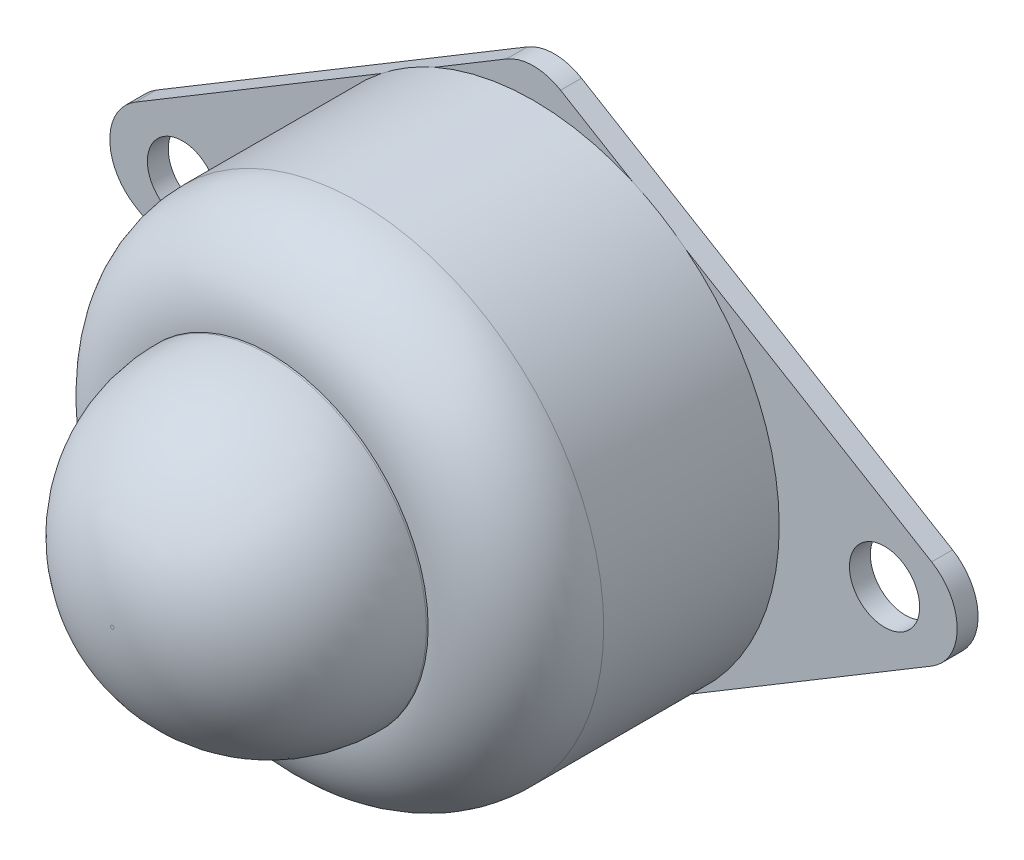
ISO-10303-21;
HEADER;
FILE_DESCRIPTION(('STEP AP214'),'2;1');
FILE_NAME('part.step','',(''),(''),'','','');
FILE_SCHEMA(('AUTOMOTIVE_DESIGN { 1 0 10303 214 1 1 1 1 }'));
ENDSEC;
DATA;
#1=APPLICATION_CONTEXT('core data for automotive mechanical design processes');
#2=APPLICATION_PROTOCOL_DEFINITION('international standard','automotive_design',2000,#1);
#3=PRODUCT_CONTEXT('',#1,'mechanical');
#4=PRODUCT('Part','Part','',(#3));
#5=PRODUCT_RELATED_PRODUCT_CATEGORY('part','',(#4));
#6=PRODUCT_DEFINITION_FORMATION('','',#4);
#7=PRODUCT_DEFINITION_CONTEXT('part definition',#1,'design');
#8=PRODUCT_DEFINITION('design','',#6,#7);
#9=PRODUCT_DEFINITION_SHAPE('','',#8);
#10=(LENGTH_UNIT() NAMED_UNIT(*) SI_UNIT(.MILLI.,.METRE.));
#11=(NAMED_UNIT(*) PLANE_ANGLE_UNIT() SI_UNIT($,.RADIAN.));
#12=(NAMED_UNIT(*) SI_UNIT($,.STERADIAN.) SOLID_ANGLE_UNIT());
#13=UNCERTAINTY_MEASURE_WITH_UNIT(LENGTH_MEASURE(1.E-05),#10,'distance_accuracy_value','');
#14=(GEOMETRIC_REPRESENTATION_CONTEXT(3) GLOBAL_UNCERTAINTY_ASSIGNED_CONTEXT((#13)) GLOBAL_UNIT_ASSIGNED_CONTEXT((#10,
#11,#12)) REPRESENTATION_CONTEXT('',''));
#15=CARTESIAN_POINT('',(0.,0.,0.));
#16=DIRECTION('',(0.,0.,1.));
#17=DIRECTION('',(1.,0.,0.));
#18=AXIS2_PLACEMENT_3D('',#15,#16,#17);
#19=CARTESIAN_POINT('',(24.,28.394448724536,1.19));
#20=DIRECTION('',(0.,0.,1.));
#21=DIRECTION('',(1.,0.,0.));
#22=AXIS2_PLACEMENT_3D('',#19,#20,#21);
#23=PLANE('',#22);
#24=CARTESIAN_POINT('',(24.0000000000002,15.6944487245361,1.19));
#25=DIRECTION('',(0.,0.,1.));
#26=DIRECTION('',(1.,0.,0.));
#27=AXIS2_PLACEMENT_3D('',#24,#25,#26);
#28=CIRCLE('',#27,14.);
#29=CARTESIAN_POINT('',(29.6262999759599,28.5141503037663,1.19));
#30=VERTEX_POINT('',#29);
#31=CARTESIAN_POINT('',(18.3737000240388,28.5141503037655,1.19));
#32=VERTEX_POINT('',#31);
#33=EDGE_CURVE('E56',#30,#32,#28,.T.);
#34=ORIENTED_EDGE('',*,*,#33,.F.);
#35=DIRECTION('',(-0.857206564544524,0.514972723259955,0.));
#36=VECTOR('',#35,1.);
#37=CARTESIAN_POINT('',(25.5449181697799,30.9660684181696,1.19));
#38=LINE('',#37,#36);
#39=CARTESIAN_POINT('',(25.5449181697799,30.9660684181696,1.19));
#40=VERTEX_POINT('',#39);
#41=EDGE_CURVE('E149',#30,#40,#38,.T.);
#42=ORIENTED_EDGE('',*,*,#41,.T.);
#43=CARTESIAN_POINT('',(24.,28.394448724536,1.19));
#44=DIRECTION('',(0.,0.,1.));
#45=DIRECTION('',(1.,0.,0.));
#46=AXIS2_PLACEMENT_3D('',#43,#44,#45);
#47=CIRCLE('',#46,3.);
#48=CARTESIAN_POINT('',(22.4550818302201,30.9660684181696,1.19));
#49=VERTEX_POINT('',#48);
#50=EDGE_CURVE('E230',#40,#49,#47,.T.);
#51=ORIENTED_EDGE('',*,*,#50,.T.);
#52=DIRECTION('',(-0.857206564544524,-0.514972723259955,0.));
#53=VECTOR('',#52,1.);
#54=CARTESIAN_POINT('',(1.31508183022014,18.2660684181696,1.19));
#55=LINE('',#54,#53);
#56=EDGE_CURVE('E328',#49,#32,#55,.T.);
#57=ORIENTED_EDGE('',*,*,#56,.T.);
#58=EDGE_LOOP('',(#34,#42,#51,#57));
#59=FACE_BOUND('',#58,.T.);
#60=ADVANCED_FACE('F38',(#59),#23,.T.);
#61=CARTESIAN_POINT('',(15.3239384633309,26.6819851277489,1.19));
#62=VERTEX_POINT('',#61);
#63=CARTESIAN_POINT('',(15.3239384633306,4.70691232132349,1.19));
#64=VERTEX_POINT('',#63);
#65=EDGE_CURVE('E183',#62,#64,#28,.T.);
#66=ORIENTED_EDGE('',*,*,#65,.F.);
#67=CARTESIAN_POINT('',(1.31508183022014,18.2660684181696,1.19));
#68=VERTEX_POINT('',#67);
#69=EDGE_CURVE('E323',#62,#68,#55,.T.);
#70=ORIENTED_EDGE('',*,*,#69,.T.);
#71=CARTESIAN_POINT('',(2.86000000000001,15.694448724536,1.19));
#72=DIRECTION('',(0.,0.,1.));
#73=DIRECTION('',(-1.,0.,0.));
#74=AXIS2_PLACEMENT_3D('',#71,#72,#73);
#75=CIRCLE('',#74,3.);
#76=CARTESIAN_POINT('',(1.31508183022016,13.1228290309024,1.19));
#77=VERTEX_POINT('',#76);
#78=EDGE_CURVE('E196',#68,#77,#75,.T.);
#79=ORIENTED_EDGE('',*,*,#78,.T.);
#80=DIRECTION('',(0.857206564544529,-0.514972723259947,0.));
#81=VECTOR('',#80,1.);
#82=CARTESIAN_POINT('',(22.4550818302204,0.422829030902577,1.19));
#83=LINE('',#82,#81);
#84=EDGE_CURVE('E192',#77,#64,#83,.T.);
#85=ORIENTED_EDGE('',*,*,#84,.T.);
#86=EDGE_LOOP('',(#66,#70,#79,#85));
#87=FACE_BOUND('',#86,.T.);
#88=CARTESIAN_POINT('',(4.,15.694448724536,1.19));
#89=DIRECTION('',(0.,0.,1.));
#90=DIRECTION('',(-1.,0.,0.));
#91=AXIS2_PLACEMENT_3D('',#88,#89,#90);
#92=CIRCLE('',#91,2.);
#93=CARTESIAN_POINT('',(2.,15.694448724536,1.19));
#94=VERTEX_POINT('',#93);
#95=EDGE_CURVE('E174',#94,#94,#92,.T.);
#96=ORIENTED_EDGE('',*,*,#95,.F.);
#97=EDGE_LOOP('',(#96));
#98=FACE_BOUND('',#97,.T.);
#99=ADVANCED_FACE('F275',(#87,#98),#23,.T.);
#100=CARTESIAN_POINT('',(18.3737000240393,2.87474714530647,1.19));
#101=VERTEX_POINT('',#100);
#102=CARTESIAN_POINT('',(29.6262999759608,2.87474714530633,1.19));
#103=VERTEX_POINT('',#102);
#104=EDGE_CURVE('E165',#101,#103,#28,.T.);
#105=ORIENTED_EDGE('',*,*,#104,.F.);
#106=CARTESIAN_POINT('',(22.4550818302204,0.422829030902577,1.19));
#107=VERTEX_POINT('',#106);
#108=EDGE_CURVE('E193',#101,#107,#83,.T.);
#109=ORIENTED_EDGE('',*,*,#108,.T.);
#110=CARTESIAN_POINT('',(24.0000000000002,2.99444872453616,1.19));
#111=DIRECTION('',(0.,0.,1.));
#112=DIRECTION('',(1.,0.,0.));
#113=AXIS2_PLACEMENT_3D('',#110,#111,#112);
#114=CIRCLE('',#113,3.);
#115=CARTESIAN_POINT('',(25.5449181697801,0.422829030902591,1.19));
#116=VERTEX_POINT('',#115);
#117=EDGE_CURVE('E195',#107,#116,#114,.T.);
#118=ORIENTED_EDGE('',*,*,#117,.T.);
#119=DIRECTION('',(0.857206564544524,0.514972723259955,0.));
#120=VECTOR('',#119,1.);
#121=CARTESIAN_POINT('',(25.5449181697801,0.422829030902591,1.19));
#122=LINE('',#121,#120);
#123=EDGE_CURVE('E202',#116,#103,#122,.T.);
#124=ORIENTED_EDGE('',*,*,#123,.T.);
#125=EDGE_LOOP('',(#105,#109,#118,#124));
#126=FACE_BOUND('',#125,.T.);
#127=ADVANCED_FACE('F280',(#126),#23,.T.);
#128=CARTESIAN_POINT('',(32.6760615366704,4.70691232132387,1.19));
#129=VERTEX_POINT('',#128);
#130=CARTESIAN_POINT('',(32.6760615366712,26.6819851277477,1.19));
#131=VERTEX_POINT('',#130);
#132=EDGE_CURVE('E64',#129,#131,#28,.T.);
#133=ORIENTED_EDGE('',*,*,#132,.F.);
#134=CARTESIAN_POINT('',(46.6849181697799,13.1228290309024,1.19));
#135=VERTEX_POINT('',#134);
#136=EDGE_CURVE('E201',#129,#135,#122,.T.);
#137=ORIENTED_EDGE('',*,*,#136,.T.);
#138=CARTESIAN_POINT('',(45.14,15.694448724536,1.19));
#139=DIRECTION('',(0.,0.,1.));
#140=DIRECTION('',(1.,0.,0.));
#141=AXIS2_PLACEMENT_3D('',#138,#139,#140);
#142=CIRCLE('',#141,3.00000000000002);
#143=CARTESIAN_POINT('',(46.6849181697799,18.2660684181696,1.19));
#144=VERTEX_POINT('',#143);
#145=EDGE_CURVE('E141',#135,#144,#142,.T.);
#146=ORIENTED_EDGE('',*,*,#145,.T.);
#147=EDGE_CURVE('E136',#144,#131,#38,.T.);
#148=ORIENTED_EDGE('',*,*,#147,.T.);
#149=EDGE_LOOP('',(#133,#137,#146,#148));
#150=FACE_BOUND('',#149,.T.);
#151=CARTESIAN_POINT('',(44.,15.694448724536,1.19));
#152=DIRECTION('',(0.,0.,1.));
#153=DIRECTION('',(1.,0.,0.));
#154=AXIS2_PLACEMENT_3D('',#151,#152,#153);
#155=CIRCLE('',#154,2.);
#156=CARTESIAN_POINT('',(46.,15.694448724536,1.19));
#157=VERTEX_POINT('',#156);
#158=EDGE_CURVE('E213',#157,#157,#155,.T.);
#159=ORIENTED_EDGE('',*,*,#158,.F.);
#160=EDGE_LOOP('',(#159));
#161=FACE_BOUND('',#160,.T.);
#162=ADVANCED_FACE('F138',(#150,#161),#23,.T.);
#163=CARTESIAN_POINT('',(24.,28.394448724536,0.));
#164=DIRECTION('',(0.,0.,1.));
#165=DIRECTION('',(1.,0.,0.));
#166=AXIS2_PLACEMENT_3D('',#163,#164,#165);
#167=PLANE('',#166);
#168=CARTESIAN_POINT('',(44.,15.694448724536,0.));
#169=DIRECTION('',(0.,0.,1.));
#170=DIRECTION('',(1.,0.,0.));
#171=AXIS2_PLACEMENT_3D('',#168,#169,#170);
#172=CIRCLE('',#171,2.);
#173=CARTESIAN_POINT('',(46.,15.694448724536,0.));
#174=VERTEX_POINT('',#173);
#175=EDGE_CURVE('E330',#174,#174,#172,.T.);
#176=ORIENTED_EDGE('',*,*,#175,.T.);
#177=EDGE_LOOP('',(#176));
#178=FACE_BOUND('',#177,.T.);
#179=CARTESIAN_POINT('',(24.,28.394448724536,0.));
#180=DIRECTION('',(0.,0.,1.));
#181=DIRECTION('',(1.,0.,0.));
#182=AXIS2_PLACEMENT_3D('',#179,#180,#181);
#183=CIRCLE('',#182,3.);
#184=CARTESIAN_POINT('',(25.5449181697799,30.9660684181696,0.));
#185=VERTEX_POINT('',#184);
#186=CARTESIAN_POINT('',(22.4550818302201,30.9660684181696,0.));
#187=VERTEX_POINT('',#186);
#188=EDGE_CURVE('E208',#185,#187,#183,.T.);
#189=ORIENTED_EDGE('',*,*,#188,.F.);
#190=DIRECTION('',(-0.857206564544524,0.514972723259955,0.));
#191=VECTOR('',#190,1.);
#192=CARTESIAN_POINT('',(25.5449181697799,30.9660684181696,0.));
#193=LINE('',#192,#191);
#194=CARTESIAN_POINT('',(46.6849181697799,18.2660684181696,0.));
#195=VERTEX_POINT('',#194);
#196=EDGE_CURVE('E227',#195,#185,#193,.T.);
#197=ORIENTED_EDGE('',*,*,#196,.F.);
#198=CARTESIAN_POINT('',(45.14,15.694448724536,0.));
#199=DIRECTION('',(0.,0.,1.));
#200=DIRECTION('',(1.,0.,0.));
#201=AXIS2_PLACEMENT_3D('',#198,#199,#200);
#202=CIRCLE('',#201,3.00000000000002);
#203=CARTESIAN_POINT('',(46.6849181697799,13.1228290309024,0.));
#204=VERTEX_POINT('',#203);
#205=EDGE_CURVE('E224',#204,#195,#202,.T.);
#206=ORIENTED_EDGE('',*,*,#205,.F.);
#207=DIRECTION('',(0.857206564544524,0.514972723259955,0.));
#208=VECTOR('',#207,1.);
#209=CARTESIAN_POINT('',(25.5449181697801,0.422829030902591,0.));
#210=LINE('',#209,#208);
#211=CARTESIAN_POINT('',(25.5449181697801,0.422829030902591,0.));
#212=VERTEX_POINT('',#211);
#213=EDGE_CURVE('E222',#212,#204,#210,.T.);
#214=ORIENTED_EDGE('',*,*,#213,.F.);
#215=CARTESIAN_POINT('',(24.0000000000002,2.99444872453616,0.));
#216=DIRECTION('',(0.,0.,1.));
#217=DIRECTION('',(1.,0.,0.));
#218=AXIS2_PLACEMENT_3D('',#215,#216,#217);
#219=CIRCLE('',#218,3.);
#220=CARTESIAN_POINT('',(22.4550818302204,0.422829030902577,0.));
#221=VERTEX_POINT('',#220);
#222=EDGE_CURVE('E220',#221,#212,#219,.T.);
#223=ORIENTED_EDGE('',*,*,#222,.F.);
#224=DIRECTION('',(0.857206564544529,-0.514972723259947,0.));
#225=VECTOR('',#224,1.);
#226=CARTESIAN_POINT('',(22.4550818302204,0.422829030902577,0.));
#227=LINE('',#226,#225);
#228=CARTESIAN_POINT('',(1.31508183022016,13.1228290309024,0.));
#229=VERTEX_POINT('',#228);
#230=EDGE_CURVE('E218',#229,#221,#227,.T.);
#231=ORIENTED_EDGE('',*,*,#230,.F.);
#232=CARTESIAN_POINT('',(2.86000000000001,15.694448724536,0.));
#233=DIRECTION('',(0.,0.,1.));
#234=DIRECTION('',(-1.,0.,0.));
#235=AXIS2_PLACEMENT_3D('',#232,#233,#234);
#236=CIRCLE('',#235,3.);
#237=CARTESIAN_POINT('',(1.31508183022014,18.2660684181696,0.));
#238=VERTEX_POINT('',#237);
#239=EDGE_CURVE('E216',#238,#229,#236,.T.);
#240=ORIENTED_EDGE('',*,*,#239,.F.);
#241=DIRECTION('',(-0.857206564544524,-0.514972723259955,0.));
#242=VECTOR('',#241,1.);
#243=CARTESIAN_POINT('',(1.31508183022014,18.2660684181696,0.));
#244=LINE('',#243,#242);
#245=EDGE_CURVE('E212',#187,#238,#244,.T.);
#246=ORIENTED_EDGE('',*,*,#245,.F.);
#247=EDGE_LOOP('',(#189,#197,#206,#214,#223,#231,#240,#246));
#248=FACE_BOUND('',#247,.T.);
#249=CARTESIAN_POINT('',(4.,15.694448724536,0.));
#250=DIRECTION('',(0.,0.,1.));
#251=DIRECTION('',(-1.,0.,0.));
#252=AXIS2_PLACEMENT_3D('',#249,#250,#251);
#253=CIRCLE('',#252,2.);
#254=CARTESIAN_POINT('',(2.,15.694448724536,0.));
#255=VERTEX_POINT('',#254);
#256=EDGE_CURVE('E170',#255,#255,#253,.T.);
#257=ORIENTED_EDGE('',*,*,#256,.T.);
#258=EDGE_LOOP('',(#257));
#259=FACE_BOUND('',#258,.T.);
#260=ADVANCED_FACE('F285',(#178,#248,#259),#167,.F.);
#261=CARTESIAN_POINT('',(24.,28.394448724536,1.19));
#262=DIRECTION('',(0.,0.,-1.));
#263=DIRECTION('',(-1.,0.,0.));
#264=AXIS2_PLACEMENT_3D('',#261,#262,#263);
#265=CYLINDRICAL_SURFACE('',#264,3.);
#266=ORIENTED_EDGE('',*,*,#188,.T.);
#267=DIRECTION('',(0.,0.,-1.));
#268=VECTOR('',#267,1.);
#269=CARTESIAN_POINT('',(22.4550818302201,30.9660684181696,1.19));
#270=LINE('',#269,#268);
#271=EDGE_CURVE('E166',#49,#187,#270,.T.);
#272=ORIENTED_EDGE('',*,*,#271,.F.);
#273=ORIENTED_EDGE('',*,*,#50,.F.);
#274=DIRECTION('',(0.,0.,-1.));
#275=VECTOR('',#274,1.);
#276=CARTESIAN_POINT('',(25.5449181697799,30.9660684181696,1.19));
#277=LINE('',#276,#275);
#278=EDGE_CURVE('E146',#40,#185,#277,.T.);
#279=ORIENTED_EDGE('',*,*,#278,.T.);
#280=EDGE_LOOP('',(#266,#272,#273,#279));
#281=FACE_BOUND('',#280,.T.);
#282=ADVANCED_FACE('F290',(#281),#265,.T.);
#283=CARTESIAN_POINT('',(1.31508183022014,18.2660684181696,1.19));
#284=DIRECTION('',(0.514972723259955,-0.857206564544524,0.));
#285=DIRECTION('',(0.857206564544525,0.514972723259955,0.));
#286=AXIS2_PLACEMENT_3D('',#283,#284,#285);
#287=PLANE('',#286);
#288=ORIENTED_EDGE('',*,*,#245,.T.);
#289=DIRECTION('',(0.,0.,-1.));
#290=VECTOR('',#289,1.);
#291=CARTESIAN_POINT('',(1.31508183022014,18.2660684181696,1.19));
#292=LINE('',#291,#290);
#293=EDGE_CURVE('E249',#68,#238,#292,.T.);
#294=ORIENTED_EDGE('',*,*,#293,.F.);
#295=ORIENTED_EDGE('',*,*,#69,.F.);
#296=EDGE_CURVE('E327',#32,#62,#55,.T.);
#297=ORIENTED_EDGE('',*,*,#296,.F.);
#298=ORIENTED_EDGE('',*,*,#56,.F.);
#299=ORIENTED_EDGE('',*,*,#271,.T.);
#300=EDGE_LOOP('',(#288,#294,#295,#297,#298,#299));
#301=FACE_BOUND('',#300,.T.);
#302=ADVANCED_FACE('F342',(#301),#287,.F.);
#303=CARTESIAN_POINT('',(2.86000000000001,15.694448724536,1.19));
#304=DIRECTION('',(0.,0.,-1.));
#305=DIRECTION('',(-1.,0.,0.));
#306=AXIS2_PLACEMENT_3D('',#303,#304,#305);
#307=CYLINDRICAL_SURFACE('',#306,3.);
#308=ORIENTED_EDGE('',*,*,#239,.T.);
#309=DIRECTION('',(0.,0.,-1.));
#310=VECTOR('',#309,1.);
#311=CARTESIAN_POINT('',(1.31508183022016,13.1228290309024,1.19));
#312=LINE('',#311,#310);
#313=EDGE_CURVE('E246',#77,#229,#312,.T.);
#314=ORIENTED_EDGE('',*,*,#313,.F.);
#315=ORIENTED_EDGE('',*,*,#78,.F.);
#316=ORIENTED_EDGE('',*,*,#293,.T.);
#317=EDGE_LOOP('',(#308,#314,#315,#316));
#318=FACE_BOUND('',#317,.T.);
#319=ADVANCED_FACE('F348',(#318),#307,.T.);
#320=CARTESIAN_POINT('',(22.4550818302204,0.422829030902577,1.19));
#321=DIRECTION('',(0.514972723259947,0.857206564544529,0.));
#322=DIRECTION('',(-0.857206564544529,0.514972723259947,0.));
#323=AXIS2_PLACEMENT_3D('',#320,#321,#322);
#324=PLANE('',#323);
#325=ORIENTED_EDGE('',*,*,#230,.T.);
#326=DIRECTION('',(0.,0.,-1.));
#327=VECTOR('',#326,1.);
#328=CARTESIAN_POINT('',(22.4550818302204,0.422829030902577,1.19));
#329=LINE('',#328,#327);
#330=EDGE_CURVE('E243',#107,#221,#329,.T.);
#331=ORIENTED_EDGE('',*,*,#330,.F.);
#332=ORIENTED_EDGE('',*,*,#108,.F.);
#333=EDGE_CURVE('E187',#64,#101,#83,.T.);
#334=ORIENTED_EDGE('',*,*,#333,.F.);
#335=ORIENTED_EDGE('',*,*,#84,.F.);
#336=ORIENTED_EDGE('',*,*,#313,.T.);
#337=EDGE_LOOP('',(#325,#331,#332,#334,#335,#336));
#338=FACE_BOUND('',#337,.T.);
#339=ADVANCED_FACE('F297',(#338),#324,.F.);
#340=CARTESIAN_POINT('',(24.0000000000002,2.99444872453616,1.19));
#341=DIRECTION('',(0.,0.,-1.));
#342=DIRECTION('',(-1.,0.,0.));
#343=AXIS2_PLACEMENT_3D('',#340,#341,#342);
#344=CYLINDRICAL_SURFACE('',#343,3.);
#345=ORIENTED_EDGE('',*,*,#222,.T.);
#346=DIRECTION('',(0.,0.,-1.));
#347=VECTOR('',#346,1.);
#348=CARTESIAN_POINT('',(25.5449181697801,0.422829030902591,1.19));
#349=LINE('',#348,#347);
#350=EDGE_CURVE('E240',#116,#212,#349,.T.);
#351=ORIENTED_EDGE('',*,*,#350,.F.);
#352=ORIENTED_EDGE('',*,*,#117,.F.);
#353=ORIENTED_EDGE('',*,*,#330,.T.);
#354=EDGE_LOOP('',(#345,#351,#352,#353));
#355=FACE_BOUND('',#354,.T.);
#356=ADVANCED_FACE('F303',(#355),#344,.T.);
#357=CARTESIAN_POINT('',(25.5449181697801,0.422829030902591,1.19));
#358=DIRECTION('',(-0.514972723259955,0.857206564544524,0.));
#359=DIRECTION('',(-0.857206564544525,-0.514972723259955,0.));
#360=AXIS2_PLACEMENT_3D('',#357,#358,#359);
#361=PLANE('',#360);
#362=ORIENTED_EDGE('',*,*,#213,.T.);
#363=DIRECTION('',(0.,0.,-1.));
#364=VECTOR('',#363,1.);
#365=CARTESIAN_POINT('',(46.6849181697799,13.1228290309024,1.19));
#366=LINE('',#365,#364);
#367=EDGE_CURVE('E237',#135,#204,#366,.T.);
#368=ORIENTED_EDGE('',*,*,#367,.F.);
#369=ORIENTED_EDGE('',*,*,#136,.F.);
#370=EDGE_CURVE('E205',#103,#129,#122,.T.);
#371=ORIENTED_EDGE('',*,*,#370,.F.);
#372=ORIENTED_EDGE('',*,*,#123,.F.);
#373=ORIENTED_EDGE('',*,*,#350,.T.);
#374=EDGE_LOOP('',(#362,#368,#369,#371,#372,#373));
#375=FACE_BOUND('',#374,.T.);
#376=ADVANCED_FACE('F306',(#375),#361,.F.);
#377=CARTESIAN_POINT('',(45.14,15.694448724536,1.19));
#378=DIRECTION('',(0.,0.,-1.));
#379=DIRECTION('',(-1.,0.,0.));
#380=AXIS2_PLACEMENT_3D('',#377,#378,#379);
#381=CYLINDRICAL_SURFACE('',#380,3.00000000000002);
#382=ORIENTED_EDGE('',*,*,#205,.T.);
#383=DIRECTION('',(0.,0.,-1.));
#384=VECTOR('',#383,1.);
#385=CARTESIAN_POINT('',(46.6849181697799,18.2660684181696,1.19));
#386=LINE('',#385,#384);
#387=EDGE_CURVE('E234',#144,#195,#386,.T.);
#388=ORIENTED_EDGE('',*,*,#387,.F.);
#389=ORIENTED_EDGE('',*,*,#145,.F.);
#390=ORIENTED_EDGE('',*,*,#367,.T.);
#391=EDGE_LOOP('',(#382,#388,#389,#390));
#392=FACE_BOUND('',#391,.T.);
#393=ADVANCED_FACE('F312',(#392),#381,.T.);
#394=CARTESIAN_POINT('',(25.5449181697799,30.9660684181696,1.19));
#395=DIRECTION('',(-0.514972723259955,-0.857206564544524,0.));
#396=DIRECTION('',(0.857206564544525,-0.514972723259955,0.));
#397=AXIS2_PLACEMENT_3D('',#394,#395,#396);
#398=PLANE('',#397);
#399=ORIENTED_EDGE('',*,*,#196,.T.);
#400=ORIENTED_EDGE('',*,*,#278,.F.);
#401=ORIENTED_EDGE('',*,*,#41,.F.);
#402=EDGE_CURVE('E147',#131,#30,#38,.T.);
#403=ORIENTED_EDGE('',*,*,#402,.F.);
#404=ORIENTED_EDGE('',*,*,#147,.F.);
#405=ORIENTED_EDGE('',*,*,#387,.T.);
#406=EDGE_LOOP('',(#399,#400,#401,#403,#404,#405));
#407=FACE_BOUND('',#406,.T.);
#408=ADVANCED_FACE('F151',(#407),#398,.F.);
#409=CARTESIAN_POINT('',(44.,15.694448724536,1.19));
#410=DIRECTION('',(0.,0.,-1.));
#411=DIRECTION('',(-1.,0.,0.));
#412=AXIS2_PLACEMENT_3D('',#409,#410,#411);
#413=CYLINDRICAL_SURFACE('',#412,2.);
#414=ORIENTED_EDGE('',*,*,#158,.T.);
#415=EDGE_LOOP('',(#414));
#416=FACE_BOUND('',#415,.T.);
#417=ORIENTED_EDGE('',*,*,#175,.F.);
#418=EDGE_LOOP('',(#417));
#419=FACE_BOUND('',#418,.T.);
#420=ADVANCED_FACE('F383',(#416,#419),#413,.F.);
#421=CARTESIAN_POINT('',(4.,15.694448724536,1.19));
#422=DIRECTION('',(0.,0.,-1.));
#423=DIRECTION('',(-1.,0.,0.));
#424=AXIS2_PLACEMENT_3D('',#421,#422,#423);
#425=CYLINDRICAL_SURFACE('',#424,2.);
#426=ORIENTED_EDGE('',*,*,#95,.T.);
#427=EDGE_LOOP('',(#426));
#428=FACE_BOUND('',#427,.T.);
#429=ORIENTED_EDGE('',*,*,#256,.F.);
#430=EDGE_LOOP('',(#429));
#431=FACE_BOUND('',#430,.T.);
#432=ADVANCED_FACE('F381',(#428,#431),#425,.F.);
#433=CARTESIAN_POINT('',(24.0000000000002,15.6944487245361,1.19));
#434=DIRECTION('',(0.,0.,1.));
#435=DIRECTION('',(1.,0.,0.));
#436=AXIS2_PLACEMENT_3D('',#433,#434,#435);
#437=PLANE('',#436);
#438=EDGE_CURVE('E171',#32,#62,#28,.T.);
#439=ORIENTED_EDGE('',*,*,#438,.F.);
#440=ORIENTED_EDGE('',*,*,#296,.T.);
#441=EDGE_LOOP('',(#439,#440));
#442=FACE_BOUND('',#441,.T.);
#443=ADVANCED_FACE('F339',(#442),#437,.F.);
#444=EDGE_CURVE('E178',#64,#101,#28,.T.);
#445=ORIENTED_EDGE('',*,*,#444,.F.);
#446=ORIENTED_EDGE('',*,*,#333,.T.);
#447=EDGE_LOOP('',(#445,#446));
#448=FACE_BOUND('',#447,.T.);
#449=ADVANCED_FACE('F186',(#448),#437,.F.);
#450=EDGE_CURVE('E163',#103,#129,#28,.T.);
#451=ORIENTED_EDGE('',*,*,#450,.F.);
#452=ORIENTED_EDGE('',*,*,#370,.T.);
#453=EDGE_LOOP('',(#451,#452));
#454=FACE_BOUND('',#453,.T.);
#455=ADVANCED_FACE('F378',(#454),#437,.F.);
#456=EDGE_CURVE('E160',#131,#30,#28,.T.);
#457=ORIENTED_EDGE('',*,*,#456,.F.);
#458=ORIENTED_EDGE('',*,*,#402,.T.);
#459=EDGE_LOOP('',(#457,#458));
#460=FACE_BOUND('',#459,.T.);
#461=ADVANCED_FACE('F168',(#460),#437,.F.);
#462=CARTESIAN_POINT('',(24.0000000000002,15.6944487245361,16.19));
#463=DIRECTION('',(0.,0.,-1.));
#464=DIRECTION('',(-1.,0.,0.));
#465=AXIS2_PLACEMENT_3D('',#462,#463,#464);
#466=CYLINDRICAL_SURFACE('',#465,14.);
#467=CARTESIAN_POINT('',(24.0000000000002,15.6944487245361,11.19));
#468=DIRECTION('',(0.,0.,1.));
#469=DIRECTION('',(1.,0.,0.));
#470=AXIS2_PLACEMENT_3D('',#467,#468,#469);
#471=CIRCLE('',#470,14.);
#472=CARTESIAN_POINT('',(38.0000000000002,15.6944487245361,11.19));
#473=VERTEX_POINT('',#472);
#474=EDGE_CURVE('E259',#473,#473,#471,.F.);
#475=ORIENTED_EDGE('',*,*,#474,.T.);
#476=EDGE_LOOP('',(#475));
#477=FACE_BOUND('',#476,.T.);
#478=ORIENTED_EDGE('',*,*,#456,.T.);
#479=ORIENTED_EDGE('',*,*,#33,.T.);
#480=ORIENTED_EDGE('',*,*,#438,.T.);
#481=ORIENTED_EDGE('',*,*,#65,.T.);
#482=ORIENTED_EDGE('',*,*,#444,.T.);
#483=ORIENTED_EDGE('',*,*,#104,.T.);
#484=ORIENTED_EDGE('',*,*,#450,.T.);
#485=ORIENTED_EDGE('',*,*,#132,.T.);
#486=EDGE_LOOP('',(#478,#479,#480,#481,#482,#483,#484,#485));
#487=FACE_BOUND('',#486,.T.);
#488=ADVANCED_FACE('F159',(#477,#487),#466,.T.);
#489=CARTESIAN_POINT('',(24.0000000000002,15.6944487245361,11.19));
#490=DIRECTION('',(0.,0.,1.));
#491=DIRECTION('',(1.,0.,0.));
#492=AXIS2_PLACEMENT_3D('',#489,#490,#491);
#493=TOROIDAL_SURFACE('',#492,9.,5.);
#494=ORIENTED_EDGE('',*,*,#474,.F.);
#495=EDGE_LOOP('',(#494));
#496=FACE_BOUND('',#495,.T.);
#497=CARTESIAN_POINT('',(24.0000000000002,15.6944487245361,16.19));
#498=DIRECTION('',(0.,0.,1.));
#499=DIRECTION('',(1.,0.,0.));
#500=AXIS2_PLACEMENT_3D('',#497,#498,#499);
#501=CIRCLE('',#500,9.);
#502=CARTESIAN_POINT('',(33.0000000000002,15.6944487245361,16.19));
#503=VERTEX_POINT('',#502);
#504=EDGE_CURVE('E256',#503,#503,#501,.T.);
#505=ORIENTED_EDGE('',*,*,#504,.F.);
#506=EDGE_LOOP('',(#505));
#507=FACE_BOUND('',#506,.T.);
#508=ADVANCED_FACE('F360',(#496,#507),#493,.T.);
#509=CARTESIAN_POINT('',(24.0000000000002,15.6944487245361,25.19));
#510=DIRECTION('',(0.,0.,-1.));
#511=DIRECTION('',(-1.,0.,0.));
#512=AXIS2_PLACEMENT_3D('',#509,#510,#511);
#513=CYLINDRICAL_SURFACE('',#512,9.);
#514=CARTESIAN_POINT('',(24.0000000000002,15.6944487245361,16.29));
#515=DIRECTION('',(0.,0.,1.));
#516=DIRECTION('',(1.,0.,0.));
#517=AXIS2_PLACEMENT_3D('',#514,#515,#516);
#518=CIRCLE('',#517,9.);
#519=CARTESIAN_POINT('',(33.0000000000002,15.6944487245361,16.29));
#520=VERTEX_POINT('',#519);
#521=EDGE_CURVE('E11',#520,#520,#518,.F.);
#522=ORIENTED_EDGE('',*,*,#521,.T.);
#523=EDGE_LOOP('',(#522));
#524=FACE_BOUND('',#523,.T.);
#525=ORIENTED_EDGE('',*,*,#504,.T.);
#526=EDGE_LOOP('',(#525));
#527=FACE_BOUND('',#526,.T.);
#528=ADVANCED_FACE('F271',(#524,#527),#513,.T.);
#529=CARTESIAN_POINT('',(24.0000000000002,15.6944487245361,25.19));
#530=DIRECTION('',(0.,0.,1.));
#531=DIRECTION('',(1.,0.,0.));
#532=AXIS2_PLACEMENT_3D('',#529,#530,#531);
#533=PLANE('',#532);
#534=CARTESIAN_POINT('',(24.0000000000002,15.6944487245361,25.19));
#535=DIRECTION('',(0.,0.,1.));
#536=DIRECTION('',(1.,0.,0.));
#537=AXIS2_PLACEMENT_3D('',#534,#535,#536);
#538=CIRCLE('',#537,0.100000000000003);
#539=CARTESIAN_POINT('',(24.1000000000003,15.6944487245361,25.19));
#540=VERTEX_POINT('',#539);
#541=EDGE_CURVE('E46',#540,#540,#538,.T.);
#542=ORIENTED_EDGE('',*,*,#541,.T.);
#543=EDGE_LOOP('',(#542));
#544=FACE_BOUND('',#543,.T.);
#545=ADVANCED_FACE('F264',(#544),#533,.T.);
#546=CARTESIAN_POINT('',(24.0000000000002,15.6944487245361,16.29));
#547=DIRECTION('',(0.,0.,1.));
#548=DIRECTION('',(1.,0.,0.));
#549=AXIS2_PLACEMENT_3D('',#546,#547,#548);
#550=DEGENERATE_TOROIDAL_SURFACE('',#549,0.100000000000003,8.9,.T.);
#551=ORIENTED_EDGE('',*,*,#521,.F.);
#552=EDGE_LOOP('',(#551));
#553=FACE_BOUND('',#552,.T.);
#554=ORIENTED_EDGE('',*,*,#541,.F.);
#555=EDGE_LOOP('',(#554));
#556=FACE_BOUND('',#555,.T.);
#557=ADVANCED_FACE('F40',(#553,#556),#550,.T.);
#558=CLOSED_SHELL('',(#60,#99,#127,#162,#260,#282,#302,#319,#339,#356,#376,#393,#408,#420,#432,
#443,#449,#455,#461,#488,#508,#528,#545,#557));
#559=MANIFOLD_SOLID_BREP('B2',#558);
#560=ADVANCED_BREP_SHAPE_REPRESENTATION('',(#18,#559),#14);
#561=SHAPE_DEFINITION_REPRESENTATION(#9,#560);
ENDSEC;
END-ISO-10303-21;
